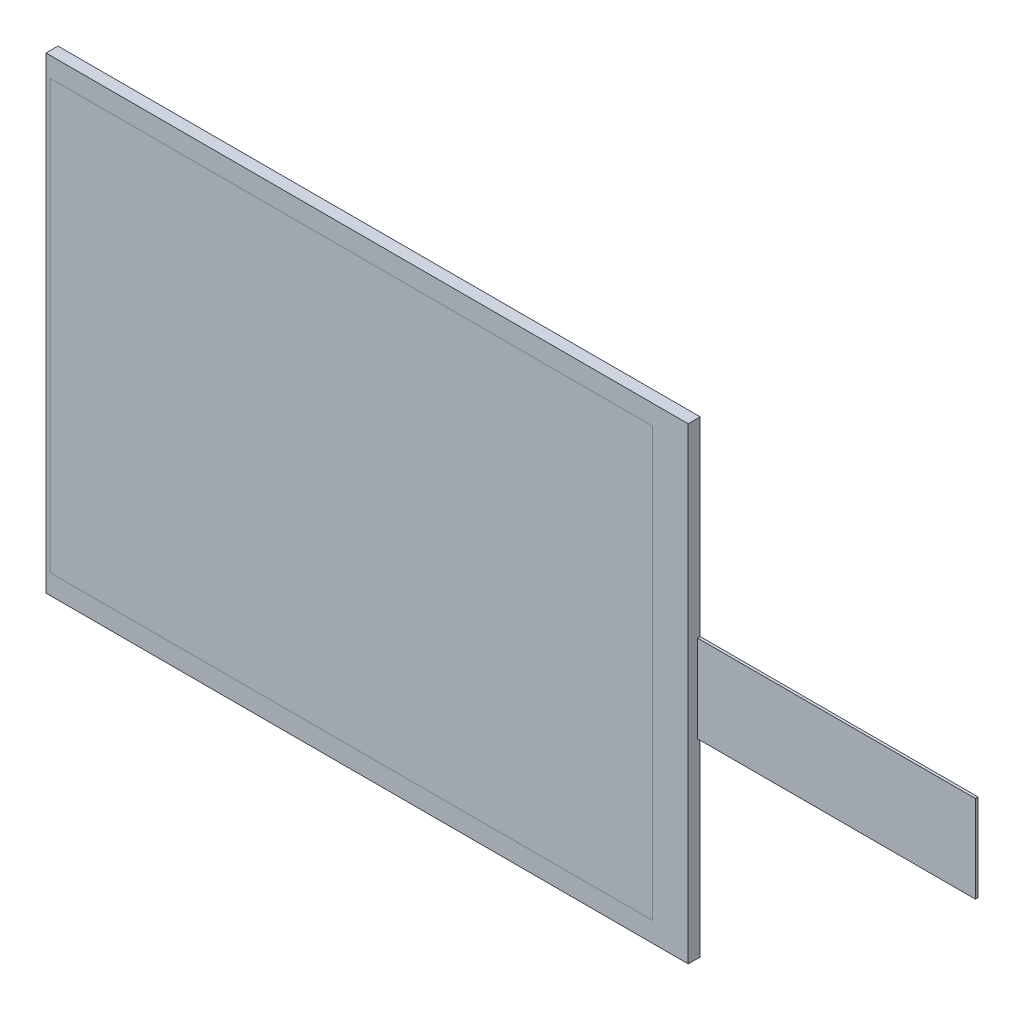
ISO-10303-21;
HEADER;
FILE_DESCRIPTION(('STEP AP214'),'2;1');
FILE_NAME('part.step','',(''),(''),'','','');
FILE_SCHEMA(('AUTOMOTIVE_DESIGN { 1 0 10303 214 1 1 1 1 }'));
ENDSEC;
DATA;
#1=APPLICATION_CONTEXT('core data for automotive mechanical design processes');
#2=APPLICATION_PROTOCOL_DEFINITION('international standard','automotive_design',2000,#1);
#3=PRODUCT_CONTEXT('',#1,'mechanical');
#4=PRODUCT('Part','Part','',(#3));
#5=PRODUCT_RELATED_PRODUCT_CATEGORY('part','',(#4));
#6=PRODUCT_DEFINITION_FORMATION('','',#4);
#7=PRODUCT_DEFINITION_CONTEXT('part definition',#1,'design');
#8=PRODUCT_DEFINITION('design','',#6,#7);
#9=PRODUCT_DEFINITION_SHAPE('','',#8);
#10=(LENGTH_UNIT() NAMED_UNIT(*) SI_UNIT(.MILLI.,.METRE.));
#11=(NAMED_UNIT(*) PLANE_ANGLE_UNIT() SI_UNIT($,.RADIAN.));
#12=(NAMED_UNIT(*) SI_UNIT($,.STERADIAN.) SOLID_ANGLE_UNIT());
#13=UNCERTAINTY_MEASURE_WITH_UNIT(LENGTH_MEASURE(1.E-05),#10,'distance_accuracy_value','');
#14=(GEOMETRIC_REPRESENTATION_CONTEXT(3) GLOBAL_UNCERTAINTY_ASSIGNED_CONTEXT((#13)) GLOBAL_UNIT_ASSIGNED_CONTEXT((#10,
#11,#12)) REPRESENTATION_CONTEXT('',''));
#15=CARTESIAN_POINT('',(0.,0.,0.));
#16=DIRECTION('',(0.,0.,1.));
#17=DIRECTION('',(1.,0.,0.));
#18=AXIS2_PLACEMENT_3D('',#15,#16,#17);
#19=CARTESIAN_POINT('',(0.,-3.3,0.2));
#20=DIRECTION('',(0.,1.,0.));
#21=DIRECTION('',(-1.,0.,0.));
#22=AXIS2_PLACEMENT_3D('',#19,#20,#21);
#23=PLANE('',#22);
#24=DIRECTION('',(1.,0.,0.));
#25=VECTOR('',#24,1.);
#26=CARTESIAN_POINT('',(0.,-3.3,0.));
#27=LINE('',#26,#25);
#28=CARTESIAN_POINT('',(25.5,-3.30000000000001,0.));
#29=VERTEX_POINT('',#28);
#30=CARTESIAN_POINT('',(46.52,-3.30000000000001,0.));
#31=VERTEX_POINT('',#30);
#32=EDGE_CURVE('E120',#29,#31,#27,.T.);
#33=ORIENTED_EDGE('',*,*,#32,.T.);
#34=DIRECTION('',(0.,0.,-1.));
#35=VECTOR('',#34,1.);
#36=CARTESIAN_POINT('',(46.52,-3.30000000000001,0.2));
#37=LINE('',#36,#35);
#38=CARTESIAN_POINT('',(46.52,-3.30000000000001,0.2));
#39=VERTEX_POINT('',#38);
#40=EDGE_CURVE('E12',#39,#31,#37,.T.);
#41=ORIENTED_EDGE('',*,*,#40,.F.);
#42=DIRECTION('',(1.,0.,0.));
#43=VECTOR('',#42,1.);
#44=CARTESIAN_POINT('',(0.,-3.3,0.2));
#45=LINE('',#44,#43);
#46=CARTESIAN_POINT('',(25.5,-3.30000000000001,0.2));
#47=VERTEX_POINT('',#46);
#48=EDGE_CURVE('E101',#47,#39,#45,.T.);
#49=ORIENTED_EDGE('',*,*,#48,.F.);
#50=DIRECTION('',(0.,0.,-1.));
#51=VECTOR('',#50,1.);
#52=CARTESIAN_POINT('',(25.5,-3.30000000000001,0.2));
#53=LINE('',#52,#51);
#54=EDGE_CURVE('E116',#47,#29,#53,.T.);
#55=ORIENTED_EDGE('',*,*,#54,.T.);
#56=EDGE_LOOP('',(#33,#41,#49,#55));
#57=FACE_BOUND('',#56,.T.);
#58=ADVANCED_FACE('F53',(#57),#23,.F.);
#59=CARTESIAN_POINT('',(46.52,0.,0.2));
#60=DIRECTION('',(-1.,0.,0.));
#61=DIRECTION('',(0.,0.,1.));
#62=AXIS2_PLACEMENT_3D('',#59,#60,#61);
#63=PLANE('',#62);
#64=DIRECTION('',(0.,1.,0.));
#65=VECTOR('',#64,1.);
#66=CARTESIAN_POINT('',(46.52,0.,0.));
#67=LINE('',#66,#65);
#68=CARTESIAN_POINT('',(46.52,3.29999999999999,0.));
#69=VERTEX_POINT('',#68);
#70=EDGE_CURVE('E107',#31,#69,#67,.T.);
#71=ORIENTED_EDGE('',*,*,#70,.T.);
#72=DIRECTION('',(0.,0.,-1.));
#73=VECTOR('',#72,1.);
#74=CARTESIAN_POINT('',(46.52,3.29999999999999,0.2));
#75=LINE('',#74,#73);
#76=CARTESIAN_POINT('',(46.52,3.29999999999999,0.2));
#77=VERTEX_POINT('',#76);
#78=EDGE_CURVE('E62',#77,#69,#75,.T.);
#79=ORIENTED_EDGE('',*,*,#78,.F.);
#80=DIRECTION('',(0.,1.,0.));
#81=VECTOR('',#80,1.);
#82=CARTESIAN_POINT('',(46.52,0.,0.2));
#83=LINE('',#82,#81);
#84=EDGE_CURVE('E96',#39,#77,#83,.T.);
#85=ORIENTED_EDGE('',*,*,#84,.F.);
#86=ORIENTED_EDGE('',*,*,#40,.T.);
#87=EDGE_LOOP('',(#71,#79,#85,#86));
#88=FACE_BOUND('',#87,.T.);
#89=ADVANCED_FACE('F106',(#88),#63,.F.);
#90=CARTESIAN_POINT('',(0.,3.30000000000002,0.2));
#91=DIRECTION('',(0.,1.,0.));
#92=DIRECTION('',(-1.,0.,0.));
#93=AXIS2_PLACEMENT_3D('',#90,#91,#92);
#94=PLANE('',#93);
#95=DIRECTION('',(1.,0.,0.));
#96=VECTOR('',#95,1.);
#97=CARTESIAN_POINT('',(0.,3.30000000000002,0.));
#98=LINE('',#97,#96);
#99=CARTESIAN_POINT('',(25.5,3.30000000000001,0.));
#100=VERTEX_POINT('',#99);
#101=EDGE_CURVE('E126',#100,#69,#98,.T.);
#102=ORIENTED_EDGE('',*,*,#101,.F.);
#103=DIRECTION('',(0.,0.,-1.));
#104=VECTOR('',#103,1.);
#105=CARTESIAN_POINT('',(25.5,3.30000000000001,0.2));
#106=LINE('',#105,#104);
#107=CARTESIAN_POINT('',(25.5,3.30000000000001,0.2));
#108=VERTEX_POINT('',#107);
#109=EDGE_CURVE('E86',#108,#100,#106,.T.);
#110=ORIENTED_EDGE('',*,*,#109,.F.);
#111=DIRECTION('',(1.,0.,0.));
#112=VECTOR('',#111,1.);
#113=CARTESIAN_POINT('',(0.,3.30000000000002,0.2));
#114=LINE('',#113,#112);
#115=EDGE_CURVE('E99',#108,#77,#114,.T.);
#116=ORIENTED_EDGE('',*,*,#115,.T.);
#117=ORIENTED_EDGE('',*,*,#78,.T.);
#118=EDGE_LOOP('',(#102,#110,#116,#117));
#119=FACE_BOUND('',#118,.T.);
#120=ADVANCED_FACE('F112',(#119),#94,.T.);
#121=CARTESIAN_POINT('',(25.5,0.,0.2));
#122=DIRECTION('',(1.,0.,0.));
#123=DIRECTION('',(0.,0.,-1.));
#124=AXIS2_PLACEMENT_3D('',#121,#122,#123);
#125=PLANE('',#124);
#126=DIRECTION('',(0.,-1.,0.));
#127=VECTOR('',#126,1.);
#128=CARTESIAN_POINT('',(25.5,0.,0.));
#129=LINE('',#128,#127);
#130=EDGE_CURVE('E89',#100,#29,#129,.T.);
#131=ORIENTED_EDGE('',*,*,#130,.T.);
#132=ORIENTED_EDGE('',*,*,#54,.F.);
#133=DIRECTION('',(0.,-1.,0.));
#134=VECTOR('',#133,1.);
#135=CARTESIAN_POINT('',(25.5,0.,0.2));
#136=LINE('',#135,#134);
#137=EDGE_CURVE('E70',#108,#47,#136,.T.);
#138=ORIENTED_EDGE('',*,*,#137,.F.);
#139=ORIENTED_EDGE('',*,*,#109,.T.);
#140=EDGE_LOOP('',(#131,#132,#138,#139));
#141=FACE_BOUND('',#140,.T.);
#142=ADVANCED_FACE('F144',(#141),#125,.F.);
#143=CARTESIAN_POINT('',(0.,0.,0.2));
#144=DIRECTION('',(0.,0.,1.));
#145=DIRECTION('',(1.,0.,0.));
#146=AXIS2_PLACEMENT_3D('',#143,#144,#145);
#147=PLANE('',#146);
#148=ORIENTED_EDGE('',*,*,#48,.T.);
#149=ORIENTED_EDGE('',*,*,#84,.T.);
#150=ORIENTED_EDGE('',*,*,#115,.F.);
#151=ORIENTED_EDGE('',*,*,#137,.T.);
#152=EDGE_LOOP('',(#148,#149,#150,#151));
#153=FACE_BOUND('',#152,.T.);
#154=ADVANCED_FACE('F97',(#153),#147,.T.);
#155=CARTESIAN_POINT('',(0.,0.,0.));
#156=DIRECTION('',(0.,0.,1.));
#157=DIRECTION('',(1.,0.,0.));
#158=AXIS2_PLACEMENT_3D('',#155,#156,#157);
#159=PLANE('',#158);
#160=ORIENTED_EDGE('',*,*,#32,.F.);
#161=ORIENTED_EDGE('',*,*,#130,.F.);
#162=ORIENTED_EDGE('',*,*,#101,.T.);
#163=ORIENTED_EDGE('',*,*,#70,.F.);
#164=EDGE_LOOP('',(#160,#161,#162,#163));
#165=FACE_BOUND('',#164,.T.);
#166=ADVANCED_FACE('F138',(#165),#159,.F.);
#167=CLOSED_SHELL('',(#58,#89,#120,#142,#154,#166));
#168=MANIFOLD_SOLID_BREP('B2',#167);
#169=CARTESIAN_POINT('',(0.,17.7,0.91));
#170=DIRECTION('',(0.,-1.,0.));
#171=DIRECTION('',(0.,0.,-1.));
#172=AXIS2_PLACEMENT_3D('',#169,#170,#171);
#173=PLANE('',#172);
#174=DIRECTION('',(-1.,0.,0.));
#175=VECTOR('',#174,1.);
#176=CARTESIAN_POINT('',(0.,17.7,0.));
#177=LINE('',#176,#175);
#178=CARTESIAN_POINT('',(25.5,17.7,0.));
#179=VERTEX_POINT('',#178);
#180=CARTESIAN_POINT('',(-23.1,17.7,0.));
#181=VERTEX_POINT('',#180);
#182=EDGE_CURVE('E323',#179,#181,#177,.T.);
#183=ORIENTED_EDGE('',*,*,#182,.T.);
#184=DIRECTION('',(0.,0.,-1.));
#185=VECTOR('',#184,1.);
#186=CARTESIAN_POINT('',(-23.1,17.7,0.91));
#187=LINE('',#186,#185);
#188=CARTESIAN_POINT('',(-23.1,17.7,0.91));
#189=VERTEX_POINT('',#188);
#190=EDGE_CURVE('E51',#189,#181,#187,.T.);
#191=ORIENTED_EDGE('',*,*,#190,.F.);
#192=DIRECTION('',(-1.,0.,0.));
#193=VECTOR('',#192,1.);
#194=CARTESIAN_POINT('',(0.,17.7,0.91));
#195=LINE('',#194,#193);
#196=CARTESIAN_POINT('',(25.5,17.7,0.91));
#197=VERTEX_POINT('',#196);
#198=EDGE_CURVE('E286',#197,#189,#195,.T.);
#199=ORIENTED_EDGE('',*,*,#198,.F.);
#200=DIRECTION('',(0.,0.,-1.));
#201=VECTOR('',#200,1.);
#202=CARTESIAN_POINT('',(25.5,17.7,0.91));
#203=LINE('',#202,#201);
#204=EDGE_CURVE('E226',#197,#179,#203,.T.);
#205=ORIENTED_EDGE('',*,*,#204,.T.);
#206=EDGE_LOOP('',(#183,#191,#199,#205));
#207=FACE_BOUND('',#206,.T.);
#208=ADVANCED_FACE('F206',(#207),#173,.F.);
#209=CARTESIAN_POINT('',(-23.1,0.,0.91));
#210=DIRECTION('',(1.,0.,0.));
#211=DIRECTION('',(0.,0.,-1.));
#212=AXIS2_PLACEMENT_3D('',#209,#210,#211);
#213=PLANE('',#212);
#214=DIRECTION('',(0.,-1.,0.));
#215=VECTOR('',#214,1.);
#216=CARTESIAN_POINT('',(-23.1,0.,0.));
#217=LINE('',#216,#215);
#218=CARTESIAN_POINT('',(-23.1,-17.7,0.));
#219=VERTEX_POINT('',#218);
#220=EDGE_CURVE('E293',#181,#219,#217,.T.);
#221=ORIENTED_EDGE('',*,*,#220,.T.);
#222=DIRECTION('',(0.,0.,-1.));
#223=VECTOR('',#222,1.);
#224=CARTESIAN_POINT('',(-23.1,-17.7,0.91));
#225=LINE('',#224,#223);
#226=CARTESIAN_POINT('',(-23.1,-17.7,0.91));
#227=VERTEX_POINT('',#226);
#228=EDGE_CURVE('E217',#227,#219,#225,.T.);
#229=ORIENTED_EDGE('',*,*,#228,.F.);
#230=DIRECTION('',(0.,-1.,0.));
#231=VECTOR('',#230,1.);
#232=CARTESIAN_POINT('',(-23.1,0.,0.91));
#233=LINE('',#232,#231);
#234=EDGE_CURVE('E280',#189,#227,#233,.T.);
#235=ORIENTED_EDGE('',*,*,#234,.F.);
#236=ORIENTED_EDGE('',*,*,#190,.T.);
#237=EDGE_LOOP('',(#221,#229,#235,#236));
#238=FACE_BOUND('',#237,.T.);
#239=ADVANCED_FACE('F292',(#238),#213,.F.);
#240=CARTESIAN_POINT('',(0.,-17.7,0.91));
#241=DIRECTION('',(0.,-1.,0.));
#242=DIRECTION('',(0.,0.,-1.));
#243=AXIS2_PLACEMENT_3D('',#240,#241,#242);
#244=PLANE('',#243);
#245=DIRECTION('',(-1.,0.,0.));
#246=VECTOR('',#245,1.);
#247=CARTESIAN_POINT('',(0.,-17.7,0.));
#248=LINE('',#247,#246);
#249=CARTESIAN_POINT('',(25.5,-17.7,0.));
#250=VERTEX_POINT('',#249);
#251=EDGE_CURVE('E327',#250,#219,#248,.T.);
#252=ORIENTED_EDGE('',*,*,#251,.F.);
#253=DIRECTION('',(0.,0.,-1.));
#254=VECTOR('',#253,1.);
#255=CARTESIAN_POINT('',(25.5,-17.7,0.91));
#256=LINE('',#255,#254);
#257=CARTESIAN_POINT('',(25.5,-17.7,0.91));
#258=VERTEX_POINT('',#257);
#259=EDGE_CURVE('E252',#258,#250,#256,.T.);
#260=ORIENTED_EDGE('',*,*,#259,.F.);
#261=DIRECTION('',(-1.,0.,0.));
#262=VECTOR('',#261,1.);
#263=CARTESIAN_POINT('',(0.,-17.7,0.91));
#264=LINE('',#263,#262);
#265=EDGE_CURVE('E285',#258,#227,#264,.T.);
#266=ORIENTED_EDGE('',*,*,#265,.T.);
#267=ORIENTED_EDGE('',*,*,#228,.T.);
#268=EDGE_LOOP('',(#252,#260,#266,#267));
#269=FACE_BOUND('',#268,.T.);
#270=ADVANCED_FACE('F298',(#269),#244,.T.);
#271=CARTESIAN_POINT('',(-22.8,0.,0.91));
#272=DIRECTION('',(1.,0.,0.));
#273=DIRECTION('',(0.,0.,-1.));
#274=AXIS2_PLACEMENT_3D('',#271,#272,#273);
#275=PLANE('',#274);
#276=DIRECTION('',(0.,-1.,0.));
#277=VECTOR('',#276,1.);
#278=CARTESIAN_POINT('',(-22.8,0.,0.));
#279=LINE('',#278,#277);
#280=CARTESIAN_POINT('',(-22.8,16.2,0.));
#281=VERTEX_POINT('',#280);
#282=CARTESIAN_POINT('',(-22.8,-16.2,0.));
#283=VERTEX_POINT('',#282);
#284=EDGE_CURVE('E309',#281,#283,#279,.T.);
#285=ORIENTED_EDGE('',*,*,#284,.F.);
#286=DIRECTION('',(0.,0.,-1.));
#287=VECTOR('',#286,1.);
#288=CARTESIAN_POINT('',(-22.8,16.2,0.91));
#289=LINE('',#288,#287);
#290=CARTESIAN_POINT('',(-22.8,16.2,0.91));
#291=VERTEX_POINT('',#290);
#292=EDGE_CURVE('E210',#291,#281,#289,.T.);
#293=ORIENTED_EDGE('',*,*,#292,.F.);
#294=DIRECTION('',(0.,-1.,0.));
#295=VECTOR('',#294,1.);
#296=CARTESIAN_POINT('',(-22.8,0.,0.91));
#297=LINE('',#296,#295);
#298=CARTESIAN_POINT('',(-22.8,-16.2,0.91));
#299=VERTEX_POINT('',#298);
#300=EDGE_CURVE('E334',#291,#299,#297,.T.);
#301=ORIENTED_EDGE('',*,*,#300,.T.);
#302=DIRECTION('',(0.,0.,-1.));
#303=VECTOR('',#302,1.);
#304=CARTESIAN_POINT('',(-22.8,-16.2,0.91));
#305=LINE('',#304,#303);
#306=EDGE_CURVE('E305',#299,#283,#305,.T.);
#307=ORIENTED_EDGE('',*,*,#306,.T.);
#308=EDGE_LOOP('',(#285,#293,#301,#307));
#309=FACE_BOUND('',#308,.T.);
#310=ADVANCED_FACE('F208',(#309),#275,.T.);
#311=CARTESIAN_POINT('',(0.,16.2,0.91));
#312=DIRECTION('',(0.,-1.,0.));
#313=DIRECTION('',(0.,0.,-1.));
#314=AXIS2_PLACEMENT_3D('',#311,#312,#313);
#315=PLANE('',#314);
#316=DIRECTION('',(-1.,0.,0.));
#317=VECTOR('',#316,1.);
#318=CARTESIAN_POINT('',(0.,16.2,0.));
#319=LINE('',#318,#317);
#320=CARTESIAN_POINT('',(22.8,16.2,0.));
#321=VERTEX_POINT('',#320);
#322=EDGE_CURVE('E313',#321,#281,#319,.T.);
#323=ORIENTED_EDGE('',*,*,#322,.F.);
#324=DIRECTION('',(0.,0.,-1.));
#325=VECTOR('',#324,1.);
#326=CARTESIAN_POINT('',(22.8,16.2,0.91));
#327=LINE('',#326,#325);
#328=CARTESIAN_POINT('',(22.8,16.2,0.91));
#329=VERTEX_POINT('',#328);
#330=EDGE_CURVE('E344',#329,#321,#327,.T.);
#331=ORIENTED_EDGE('',*,*,#330,.F.);
#332=DIRECTION('',(-1.,0.,0.));
#333=VECTOR('',#332,1.);
#334=CARTESIAN_POINT('',(0.,16.2,0.91));
#335=LINE('',#334,#333);
#336=EDGE_CURVE('E357',#329,#291,#335,.T.);
#337=ORIENTED_EDGE('',*,*,#336,.T.);
#338=ORIENTED_EDGE('',*,*,#292,.T.);
#339=EDGE_LOOP('',(#323,#331,#337,#338));
#340=FACE_BOUND('',#339,.T.);
#341=ADVANCED_FACE('F355',(#340),#315,.T.);
#342=CARTESIAN_POINT('',(22.8,0.,0.91));
#343=DIRECTION('',(1.,0.,0.));
#344=DIRECTION('',(0.,0.,-1.));
#345=AXIS2_PLACEMENT_3D('',#342,#343,#344);
#346=PLANE('',#345);
#347=DIRECTION('',(0.,-1.,0.));
#348=VECTOR('',#347,1.);
#349=CARTESIAN_POINT('',(22.8,0.,0.));
#350=LINE('',#349,#348);
#351=CARTESIAN_POINT('',(22.8,-16.2,0.));
#352=VERTEX_POINT('',#351);
#353=EDGE_CURVE('E316',#321,#352,#350,.T.);
#354=ORIENTED_EDGE('',*,*,#353,.T.);
#355=DIRECTION('',(0.,0.,-1.));
#356=VECTOR('',#355,1.);
#357=CARTESIAN_POINT('',(22.8,-16.2,0.91));
#358=LINE('',#357,#356);
#359=CARTESIAN_POINT('',(22.8,-16.2,0.91));
#360=VERTEX_POINT('',#359);
#361=EDGE_CURVE('E341',#360,#352,#358,.T.);
#362=ORIENTED_EDGE('',*,*,#361,.F.);
#363=DIRECTION('',(0.,-1.,0.));
#364=VECTOR('',#363,1.);
#365=CARTESIAN_POINT('',(22.8,0.,0.91));
#366=LINE('',#365,#364);
#367=EDGE_CURVE('E371',#329,#360,#366,.T.);
#368=ORIENTED_EDGE('',*,*,#367,.F.);
#369=ORIENTED_EDGE('',*,*,#330,.T.);
#370=EDGE_LOOP('',(#354,#362,#368,#369));
#371=FACE_BOUND('',#370,.T.);
#372=ADVANCED_FACE('F364',(#371),#346,.F.);
#373=CARTESIAN_POINT('',(0.,-16.2,0.91));
#374=DIRECTION('',(0.,-1.,0.));
#375=DIRECTION('',(0.,0.,-1.));
#376=AXIS2_PLACEMENT_3D('',#373,#374,#375);
#377=PLANE('',#376);
#378=DIRECTION('',(-1.,0.,0.));
#379=VECTOR('',#378,1.);
#380=CARTESIAN_POINT('',(0.,-16.2,0.));
#381=LINE('',#380,#379);
#382=EDGE_CURVE('E319',#352,#283,#381,.T.);
#383=ORIENTED_EDGE('',*,*,#382,.T.);
#384=ORIENTED_EDGE('',*,*,#306,.F.);
#385=DIRECTION('',(-1.,0.,0.));
#386=VECTOR('',#385,1.);
#387=CARTESIAN_POINT('',(0.,-16.2,0.91));
#388=LINE('',#387,#386);
#389=EDGE_CURVE('E368',#360,#299,#388,.T.);
#390=ORIENTED_EDGE('',*,*,#389,.F.);
#391=ORIENTED_EDGE('',*,*,#361,.T.);
#392=EDGE_LOOP('',(#383,#384,#390,#391));
#393=FACE_BOUND('',#392,.T.);
#394=ADVANCED_FACE('F367',(#393),#377,.F.);
#395=CARTESIAN_POINT('',(25.5,0.,0.91));
#396=DIRECTION('',(1.,0.,0.));
#397=DIRECTION('',(0.,0.,-1.));
#398=AXIS2_PLACEMENT_3D('',#395,#396,#397);
#399=PLANE('',#398);
#400=DIRECTION('',(0.,-1.,0.));
#401=VECTOR('',#400,1.);
#402=CARTESIAN_POINT('',(25.5,0.,0.));
#403=LINE('',#402,#401);
#404=EDGE_CURVE('E330',#179,#250,#403,.T.);
#405=ORIENTED_EDGE('',*,*,#404,.F.);
#406=ORIENTED_EDGE('',*,*,#204,.F.);
#407=DIRECTION('',(0.,-1.,0.));
#408=VECTOR('',#407,1.);
#409=CARTESIAN_POINT('',(25.5,0.,0.91));
#410=LINE('',#409,#408);
#411=EDGE_CURVE('E300',#197,#258,#410,.T.);
#412=ORIENTED_EDGE('',*,*,#411,.T.);
#413=ORIENTED_EDGE('',*,*,#259,.T.);
#414=EDGE_LOOP('',(#405,#406,#412,#413));
#415=FACE_BOUND('',#414,.T.);
#416=ADVANCED_FACE('F379',(#415),#399,.T.);
#417=CARTESIAN_POINT('',(0.,0.,0.91));
#418=DIRECTION('',(0.,0.,1.));
#419=DIRECTION('',(1.,0.,0.));
#420=AXIS2_PLACEMENT_3D('',#417,#418,#419);
#421=PLANE('',#420);
#422=ORIENTED_EDGE('',*,*,#300,.F.);
#423=ORIENTED_EDGE('',*,*,#336,.F.);
#424=ORIENTED_EDGE('',*,*,#367,.T.);
#425=ORIENTED_EDGE('',*,*,#389,.T.);
#426=EDGE_LOOP('',(#422,#423,#424,#425));
#427=FACE_BOUND('',#426,.T.);
#428=ORIENTED_EDGE('',*,*,#198,.T.);
#429=ORIENTED_EDGE('',*,*,#234,.T.);
#430=ORIENTED_EDGE('',*,*,#265,.F.);
#431=ORIENTED_EDGE('',*,*,#411,.F.);
#432=EDGE_LOOP('',(#428,#429,#430,#431));
#433=FACE_BOUND('',#432,.T.);
#434=ADVANCED_FACE('F282',(#427,#433),#421,.T.);
#435=CARTESIAN_POINT('',(0.,0.,0.));
#436=DIRECTION('',(0.,0.,1.));
#437=DIRECTION('',(1.,0.,0.));
#438=AXIS2_PLACEMENT_3D('',#435,#436,#437);
#439=PLANE('',#438);
#440=ORIENTED_EDGE('',*,*,#284,.T.);
#441=ORIENTED_EDGE('',*,*,#382,.F.);
#442=ORIENTED_EDGE('',*,*,#353,.F.);
#443=ORIENTED_EDGE('',*,*,#322,.T.);
#444=EDGE_LOOP('',(#440,#441,#442,#443));
#445=FACE_BOUND('',#444,.T.);
#446=ORIENTED_EDGE('',*,*,#182,.F.);
#447=ORIENTED_EDGE('',*,*,#404,.T.);
#448=ORIENTED_EDGE('',*,*,#251,.T.);
#449=ORIENTED_EDGE('',*,*,#220,.F.);
#450=EDGE_LOOP('',(#446,#447,#448,#449));
#451=FACE_BOUND('',#450,.T.);
#452=ADVANCED_FACE('F361',(#445,#451),#439,.F.);
#453=CLOSED_SHELL('',(#208,#239,#270,#310,#341,#372,#394,#416,#434,#452));
#454=MANIFOLD_SOLID_BREP('B6',#453);
#455=CARTESIAN_POINT('',(0.,16.2,0.91));
#456=DIRECTION('',(0.,-1.,0.));
#457=DIRECTION('',(0.,0.,-1.));
#458=AXIS2_PLACEMENT_3D('',#455,#456,#457);
#459=PLANE('',#458);
#460=DIRECTION('',(-1.,0.,0.));
#461=VECTOR('',#460,1.);
#462=CARTESIAN_POINT('',(0.,16.2,0.));
#463=LINE('',#462,#461);
#464=CARTESIAN_POINT('',(22.8,16.2,0.));
#465=VERTEX_POINT('',#464);
#466=CARTESIAN_POINT('',(-22.8,16.2,0.));
#467=VERTEX_POINT('',#466);
#468=EDGE_CURVE('E541',#465,#467,#463,.T.);
#469=ORIENTED_EDGE('',*,*,#468,.T.);
#470=DIRECTION('',(0.,0.,-1.));
#471=VECTOR('',#470,1.);
#472=CARTESIAN_POINT('',(-22.8,16.2,0.91));
#473=LINE('',#472,#471);
#474=CARTESIAN_POINT('',(-22.8,16.2,0.91));
#475=VERTEX_POINT('',#474);
#476=EDGE_CURVE('E204',#475,#467,#473,.T.);
#477=ORIENTED_EDGE('',*,*,#476,.F.);
#478=DIRECTION('',(-1.,0.,0.));
#479=VECTOR('',#478,1.);
#480=CARTESIAN_POINT('',(0.,16.2,0.91));
#481=LINE('',#480,#479);
#482=CARTESIAN_POINT('',(22.8,16.2,0.91));
#483=VERTEX_POINT('',#482);
#484=EDGE_CURVE('E522',#483,#475,#481,.T.);
#485=ORIENTED_EDGE('',*,*,#484,.F.);
#486=DIRECTION('',(0.,0.,-1.));
#487=VECTOR('',#486,1.);
#488=CARTESIAN_POINT('',(22.8,16.2,0.91));
#489=LINE('',#488,#487);
#490=EDGE_CURVE('E489',#483,#465,#489,.T.);
#491=ORIENTED_EDGE('',*,*,#490,.T.);
#492=EDGE_LOOP('',(#469,#477,#485,#491));
#493=FACE_BOUND('',#492,.T.);
#494=ADVANCED_FACE('F472',(#493),#459,.F.);
#495=CARTESIAN_POINT('',(-22.8,0.,0.91));
#496=DIRECTION('',(1.,0.,0.));
#497=DIRECTION('',(0.,0.,-1.));
#498=AXIS2_PLACEMENT_3D('',#495,#496,#497);
#499=PLANE('',#498);
#500=DIRECTION('',(0.,-1.,0.));
#501=VECTOR('',#500,1.);
#502=CARTESIAN_POINT('',(-22.8,0.,0.));
#503=LINE('',#502,#501);
#504=CARTESIAN_POINT('',(-22.8,-16.2,0.));
#505=VERTEX_POINT('',#504);
#506=EDGE_CURVE('E528',#467,#505,#503,.T.);
#507=ORIENTED_EDGE('',*,*,#506,.T.);
#508=DIRECTION('',(0.,0.,-1.));
#509=VECTOR('',#508,1.);
#510=CARTESIAN_POINT('',(-22.8,-16.2,0.91));
#511=LINE('',#510,#509);
#512=CARTESIAN_POINT('',(-22.8,-16.2,0.91));
#513=VERTEX_POINT('',#512);
#514=EDGE_CURVE('E481',#513,#505,#511,.T.);
#515=ORIENTED_EDGE('',*,*,#514,.F.);
#516=DIRECTION('',(0.,-1.,0.));
#517=VECTOR('',#516,1.);
#518=CARTESIAN_POINT('',(-22.8,0.,0.91));
#519=LINE('',#518,#517);
#520=EDGE_CURVE('E514',#475,#513,#519,.T.);
#521=ORIENTED_EDGE('',*,*,#520,.F.);
#522=ORIENTED_EDGE('',*,*,#476,.T.);
#523=EDGE_LOOP('',(#507,#515,#521,#522));
#524=FACE_BOUND('',#523,.T.);
#525=ADVANCED_FACE('F527',(#524),#499,.F.);
#526=CARTESIAN_POINT('',(0.,-16.2,0.91));
#527=DIRECTION('',(0.,-1.,0.));
#528=DIRECTION('',(0.,0.,-1.));
#529=AXIS2_PLACEMENT_3D('',#526,#527,#528);
#530=PLANE('',#529);
#531=DIRECTION('',(-1.,0.,0.));
#532=VECTOR('',#531,1.);
#533=CARTESIAN_POINT('',(0.,-16.2,0.));
#534=LINE('',#533,#532);
#535=CARTESIAN_POINT('',(22.8,-16.2,0.));
#536=VERTEX_POINT('',#535);
#537=EDGE_CURVE('E546',#536,#505,#534,.T.);
#538=ORIENTED_EDGE('',*,*,#537,.F.);
#539=DIRECTION('',(0.,0.,-1.));
#540=VECTOR('',#539,1.);
#541=CARTESIAN_POINT('',(22.8,-16.2,0.91));
#542=LINE('',#541,#540);
#543=CARTESIAN_POINT('',(22.8,-16.2,0.91));
#544=VERTEX_POINT('',#543);
#545=EDGE_CURVE('E503',#544,#536,#542,.T.);
#546=ORIENTED_EDGE('',*,*,#545,.F.);
#547=DIRECTION('',(-1.,0.,0.));
#548=VECTOR('',#547,1.);
#549=CARTESIAN_POINT('',(0.,-16.2,0.91));
#550=LINE('',#549,#548);
#551=EDGE_CURVE('E521',#544,#513,#550,.T.);
#552=ORIENTED_EDGE('',*,*,#551,.T.);
#553=ORIENTED_EDGE('',*,*,#514,.T.);
#554=EDGE_LOOP('',(#538,#546,#552,#553));
#555=FACE_BOUND('',#554,.T.);
#556=ADVANCED_FACE('F532',(#555),#530,.T.);
#557=CARTESIAN_POINT('',(22.8,0.,0.91));
#558=DIRECTION('',(1.,0.,0.));
#559=DIRECTION('',(0.,0.,-1.));
#560=AXIS2_PLACEMENT_3D('',#557,#558,#559);
#561=PLANE('',#560);
#562=DIRECTION('',(0.,-1.,0.));
#563=VECTOR('',#562,1.);
#564=CARTESIAN_POINT('',(22.8,0.,0.));
#565=LINE('',#564,#563);
#566=EDGE_CURVE('E549',#465,#536,#565,.T.);
#567=ORIENTED_EDGE('',*,*,#566,.F.);
#568=ORIENTED_EDGE('',*,*,#490,.F.);
#569=DIRECTION('',(0.,-1.,0.));
#570=VECTOR('',#569,1.);
#571=CARTESIAN_POINT('',(22.8,0.,0.91));
#572=LINE('',#571,#570);
#573=EDGE_CURVE('E534',#483,#544,#572,.T.);
#574=ORIENTED_EDGE('',*,*,#573,.T.);
#575=ORIENTED_EDGE('',*,*,#545,.T.);
#576=EDGE_LOOP('',(#567,#568,#574,#575));
#577=FACE_BOUND('',#576,.T.);
#578=ADVANCED_FACE('F558',(#577),#561,.T.);
#579=CARTESIAN_POINT('',(0.,0.,0.91));
#580=DIRECTION('',(0.,0.,1.));
#581=DIRECTION('',(1.,0.,0.));
#582=AXIS2_PLACEMENT_3D('',#579,#580,#581);
#583=PLANE('',#582);
#584=ORIENTED_EDGE('',*,*,#484,.T.);
#585=ORIENTED_EDGE('',*,*,#520,.T.);
#586=ORIENTED_EDGE('',*,*,#551,.F.);
#587=ORIENTED_EDGE('',*,*,#573,.F.);
#588=EDGE_LOOP('',(#584,#585,#586,#587));
#589=FACE_BOUND('',#588,.T.);
#590=ADVANCED_FACE('F518',(#589),#583,.T.);
#591=CARTESIAN_POINT('',(0.,0.,0.));
#592=DIRECTION('',(0.,0.,1.));
#593=DIRECTION('',(1.,0.,0.));
#594=AXIS2_PLACEMENT_3D('',#591,#592,#593);
#595=PLANE('',#594);
#596=ORIENTED_EDGE('',*,*,#468,.F.);
#597=ORIENTED_EDGE('',*,*,#566,.T.);
#598=ORIENTED_EDGE('',*,*,#537,.T.);
#599=ORIENTED_EDGE('',*,*,#506,.F.);
#600=EDGE_LOOP('',(#596,#597,#598,#599));
#601=FACE_BOUND('',#600,.T.);
#602=ADVANCED_FACE('F557',(#601),#595,.F.);
#603=CLOSED_SHELL('',(#494,#525,#556,#578,#590,#602));
#604=MANIFOLD_SOLID_BREP('B45',#603);
#605=ADVANCED_BREP_SHAPE_REPRESENTATION('',(#18,#168,#454,#604),#14);
#606=SHAPE_DEFINITION_REPRESENTATION(#9,#605);
ENDSEC;
END-ISO-10303-21;
